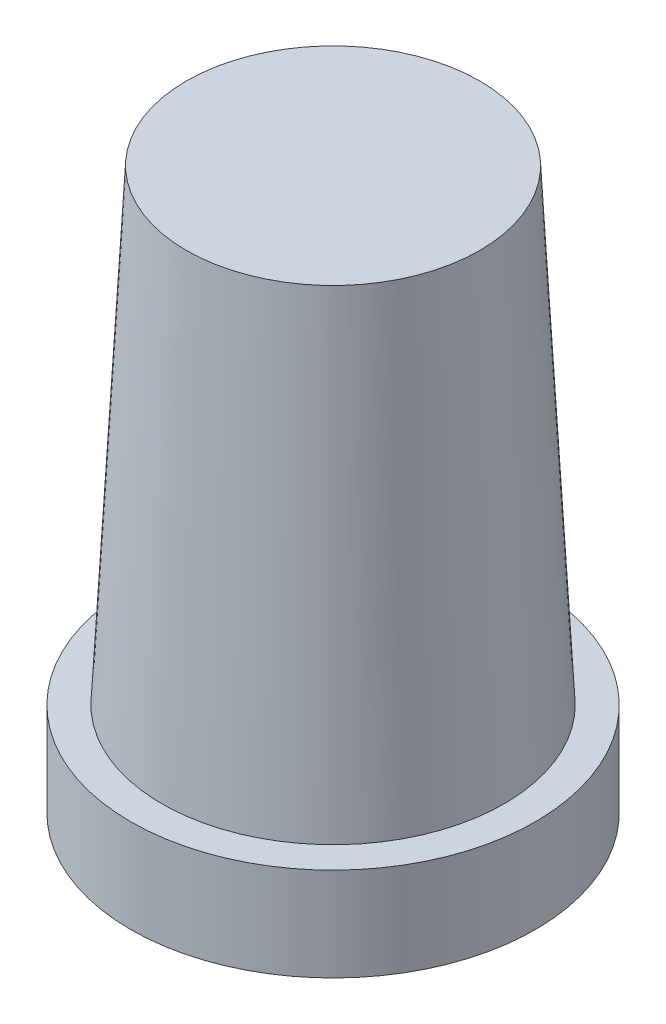
ISO-10303-21;
HEADER;
FILE_DESCRIPTION(('STEP AP214'),'2;1');
FILE_NAME('part.step','',(''),(''),'','','');
FILE_SCHEMA(('AUTOMOTIVE_DESIGN { 1 0 10303 214 1 1 1 1 }'));
ENDSEC;
DATA;
#1=APPLICATION_CONTEXT('core data for automotive mechanical design processes');
#2=APPLICATION_PROTOCOL_DEFINITION('international standard','automotive_design',2000,#1);
#3=PRODUCT_CONTEXT('',#1,'mechanical');
#4=PRODUCT('Part','Part','',(#3));
#5=PRODUCT_RELATED_PRODUCT_CATEGORY('part','',(#4));
#6=PRODUCT_DEFINITION_FORMATION('','',#4);
#7=PRODUCT_DEFINITION_CONTEXT('part definition',#1,'design');
#8=PRODUCT_DEFINITION('design','',#6,#7);
#9=PRODUCT_DEFINITION_SHAPE('','',#8);
#10=(LENGTH_UNIT() NAMED_UNIT(*) SI_UNIT(.MILLI.,.METRE.));
#11=(NAMED_UNIT(*) PLANE_ANGLE_UNIT() SI_UNIT($,.RADIAN.));
#12=(NAMED_UNIT(*) SI_UNIT($,.STERADIAN.) SOLID_ANGLE_UNIT());
#13=UNCERTAINTY_MEASURE_WITH_UNIT(LENGTH_MEASURE(1.E-05),#10,'distance_accuracy_value','');
#14=(GEOMETRIC_REPRESENTATION_CONTEXT(3) GLOBAL_UNCERTAINTY_ASSIGNED_CONTEXT((#13)) GLOBAL_UNIT_ASSIGNED_CONTEXT((#10,
#11,#12)) REPRESENTATION_CONTEXT('',''));
#15=CARTESIAN_POINT('',(0.,0.,0.));
#16=DIRECTION('',(0.,0.,1.));
#17=DIRECTION('',(1.,0.,0.));
#18=AXIS2_PLACEMENT_3D('',#15,#16,#17);
#19=CARTESIAN_POINT('',(0.,18.,0.));
#20=DIRECTION('',(0.,-1.,0.));
#21=DIRECTION('',(0.,0.,-1.));
#22=AXIS2_PLACEMENT_3D('',#19,#20,#21);
#23=CYLINDRICAL_SURFACE('',#22,6.5);
#24=CARTESIAN_POINT('',(0.,0.,0.));
#25=DIRECTION('',(0.,1.,0.));
#26=DIRECTION('',(0.,0.,1.));
#27=AXIS2_PLACEMENT_3D('',#24,#25,#26);
#28=CIRCLE('',#27,6.5);
#29=CARTESIAN_POINT('',(0.,0.,6.5));
#30=VERTEX_POINT('',#29);
#31=EDGE_CURVE('E88',#30,#30,#28,.T.);
#32=ORIENTED_EDGE('',*,*,#31,.T.);
#33=EDGE_LOOP('',(#32));
#34=FACE_BOUND('',#33,.T.);
#35=CARTESIAN_POINT('',(0.,3.,0.));
#36=DIRECTION('',(0.,1.,0.));
#37=DIRECTION('',(0.,0.,1.));
#38=AXIS2_PLACEMENT_3D('',#35,#36,#37);
#39=CIRCLE('',#38,6.5);
#40=CARTESIAN_POINT('',(0.,3.,6.5));
#41=VERTEX_POINT('',#40);
#42=EDGE_CURVE('E77',#41,#41,#39,.T.);
#43=ORIENTED_EDGE('',*,*,#42,.F.);
#44=EDGE_LOOP('',(#43));
#45=FACE_BOUND('',#44,.T.);
#46=ADVANCED_FACE('F36',(#34,#45),#23,.T.);
#47=CARTESIAN_POINT('',(0.,0.,0.));
#48=DIRECTION('',(0.,1.,0.));
#49=DIRECTION('',(0.,0.,1.));
#50=AXIS2_PLACEMENT_3D('',#47,#48,#49);
#51=PLANE('',#50);
#52=CARTESIAN_POINT('',(0.,0.,0.));
#53=DIRECTION('',(0.,1.,0.));
#54=DIRECTION('',(0.,0.,1.));
#55=AXIS2_PLACEMENT_3D('',#52,#53,#54);
#56=CIRCLE('',#55,5.57735026918963);
#57=CARTESIAN_POINT('',(0.,0.,5.57735026918963));
#58=VERTEX_POINT('',#57);
#59=EDGE_CURVE('E44',#58,#58,#56,.T.);
#60=ORIENTED_EDGE('',*,*,#59,.T.);
#61=EDGE_LOOP('',(#60));
#62=FACE_BOUND('',#61,.T.);
#63=ORIENTED_EDGE('',*,*,#31,.F.);
#64=EDGE_LOOP('',(#63));
#65=FACE_BOUND('',#64,.T.);
#66=ADVANCED_FACE('F97',(#62,#65),#51,.F.);
#67=CARTESIAN_POINT('',(0.,4.,0.));
#68=DIRECTION('',(0.,-1.,0.));
#69=DIRECTION('',(0.,0.,-1.));
#70=AXIS2_PLACEMENT_3D('',#67,#68,#69);
#71=CYLINDRICAL_SURFACE('',#70,5.);
#72=CARTESIAN_POINT('',(0.,1.00000000000001,0.));
#73=DIRECTION('',(0.,1.,0.));
#74=DIRECTION('',(0.,0.,1.));
#75=AXIS2_PLACEMENT_3D('',#72,#73,#74);
#76=CIRCLE('',#75,5.);
#77=CARTESIAN_POINT('',(0.,1.00000000000001,5.));
#78=VERTEX_POINT('',#77);
#79=EDGE_CURVE('E91',#78,#78,#76,.F.);
#80=ORIENTED_EDGE('',*,*,#79,.T.);
#81=EDGE_LOOP('',(#80));
#82=FACE_BOUND('',#81,.T.);
#83=CARTESIAN_POINT('',(0.,4.,0.));
#84=DIRECTION('',(0.,-1.,0.));
#85=DIRECTION('',(0.,0.,-1.));
#86=AXIS2_PLACEMENT_3D('',#83,#84,#85);
#87=CIRCLE('',#86,5.);
#88=CARTESIAN_POINT('',(0.,4.,-5.));
#89=VERTEX_POINT('',#88);
#90=EDGE_CURVE('E67',#89,#89,#87,.T.);
#91=ORIENTED_EDGE('',*,*,#90,.F.);
#92=EDGE_LOOP('',(#91));
#93=FACE_BOUND('',#92,.T.);
#94=ADVANCED_FACE('F107',(#82,#93),#71,.F.);
#95=CARTESIAN_POINT('',(0.,4.,0.));
#96=DIRECTION('',(0.,-1.,0.));
#97=DIRECTION('',(0.,0.,-1.));
#98=AXIS2_PLACEMENT_3D('',#95,#96,#97);
#99=PLANE('',#98);
#100=CARTESIAN_POINT('',(0.,4.,0.));
#101=DIRECTION('',(0.,-1.,0.));
#102=DIRECTION('',(0.,0.,1.));
#103=AXIS2_PLACEMENT_3D('',#100,#101,#102);
#104=CIRCLE('',#103,3.1);
#105=CARTESIAN_POINT('',(3.04828024000763,4.,-0.563903873349911));
#106=VERTEX_POINT('',#105);
#107=CARTESIAN_POINT('',(-1.73205550705109,4.,-2.57098886043756));
#108=VERTEX_POINT('',#107);
#109=EDGE_CURVE('E51',#106,#108,#104,.T.);
#110=ORIENTED_EDGE('',*,*,#109,.F.);
#111=DIRECTION('',(0.922027274643373,0.,0.387124921457807));
#112=VECTOR('',#111,1.);
#113=CARTESIAN_POINT('',(-1.73205550705109,4.,-2.57098886043756));
#114=LINE('',#113,#112);
#115=EDGE_CURVE('E71',#108,#106,#114,.T.);
#116=ORIENTED_EDGE('',*,*,#115,.F.);
#117=EDGE_LOOP('',(#110,#116));
#118=FACE_BOUND('',#117,.T.);
#119=ORIENTED_EDGE('',*,*,#90,.T.);
#120=EDGE_LOOP('',(#119));
#121=FACE_BOUND('',#120,.T.);
#122=ADVANCED_FACE('F75',(#118,#121),#99,.T.);
#123=CARTESIAN_POINT('',(0.,16.,0.));
#124=DIRECTION('',(0.,-1.,0.));
#125=DIRECTION('',(0.,0.,-1.));
#126=AXIS2_PLACEMENT_3D('',#123,#124,#125);
#127=CYLINDRICAL_SURFACE('',#126,3.1);
#128=ORIENTED_EDGE('',*,*,#109,.T.);
#129=DIRECTION('',(0.,-1.,0.));
#130=VECTOR('',#129,1.);
#131=CARTESIAN_POINT('',(-1.73205550705109,16.,-2.57098886043756));
#132=LINE('',#131,#130);
#133=CARTESIAN_POINT('',(-1.73205550705109,16.,-2.57098886043756));
#134=VERTEX_POINT('',#133);
#135=EDGE_CURVE('E68',#134,#108,#132,.T.);
#136=ORIENTED_EDGE('',*,*,#135,.F.);
#137=CARTESIAN_POINT('',(0.,16.,0.));
#138=DIRECTION('',(0.,-1.,0.));
#139=DIRECTION('',(0.,0.,1.));
#140=AXIS2_PLACEMENT_3D('',#137,#138,#139);
#141=CIRCLE('',#140,3.1);
#142=CARTESIAN_POINT('',(3.04828024000763,16.,-0.563903873349911));
#143=VERTEX_POINT('',#142);
#144=EDGE_CURVE('E65',#143,#134,#141,.T.);
#145=ORIENTED_EDGE('',*,*,#144,.F.);
#146=DIRECTION('',(0.,-1.,0.));
#147=VECTOR('',#146,1.);
#148=CARTESIAN_POINT('',(3.04828024000763,16.,-0.563903873349911));
#149=LINE('',#148,#147);
#150=EDGE_CURVE('E59',#143,#106,#149,.T.);
#151=ORIENTED_EDGE('',*,*,#150,.T.);
#152=EDGE_LOOP('',(#128,#136,#145,#151));
#153=FACE_BOUND('',#152,.T.);
#154=ADVANCED_FACE('F63',(#153),#127,.F.);
#155=CARTESIAN_POINT('',(-1.73205550705109,16.,-2.57098886043756));
#156=DIRECTION('',(0.387124921457807,0.,-0.922027274643373));
#157=DIRECTION('',(-0.922027274643373,0.,-0.387124921457807));
#158=AXIS2_PLACEMENT_3D('',#155,#156,#157);
#159=PLANE('',#158);
#160=ORIENTED_EDGE('',*,*,#115,.T.);
#161=ORIENTED_EDGE('',*,*,#150,.F.);
#162=DIRECTION('',(0.922027274643373,0.,0.387124921457807));
#163=VECTOR('',#162,1.);
#164=CARTESIAN_POINT('',(-1.73205550705109,16.,-2.57098886043756));
#165=LINE('',#164,#163);
#166=EDGE_CURVE('E82',#134,#143,#165,.T.);
#167=ORIENTED_EDGE('',*,*,#166,.F.);
#168=ORIENTED_EDGE('',*,*,#135,.T.);
#169=EDGE_LOOP('',(#160,#161,#167,#168));
#170=FACE_BOUND('',#169,.T.);
#171=ADVANCED_FACE('F72',(#170),#159,.F.);
#172=CARTESIAN_POINT('',(0.,16.,0.));
#173=DIRECTION('',(0.,1.,0.));
#174=DIRECTION('',(0.,0.,1.));
#175=AXIS2_PLACEMENT_3D('',#172,#173,#174);
#176=PLANE('',#175);
#177=ORIENTED_EDGE('',*,*,#144,.T.);
#178=ORIENTED_EDGE('',*,*,#166,.T.);
#179=EDGE_LOOP('',(#177,#178));
#180=FACE_BOUND('',#179,.T.);
#181=ADVANCED_FACE('F104',(#180),#176,.F.);
#182=CARTESIAN_POINT('',(0.,1.00000000000001,0.));
#183=DIRECTION('',(0.,-1.,0.));
#184=DIRECTION('',(0.,0.,-1.));
#185=AXIS2_PLACEMENT_3D('',#182,#183,#184);
#186=CONICAL_SURFACE('',#185,5.,0.523598775598297);
#187=ORIENTED_EDGE('',*,*,#59,.F.);
#188=EDGE_LOOP('',(#187));
#189=FACE_BOUND('',#188,.T.);
#190=ORIENTED_EDGE('',*,*,#79,.F.);
#191=EDGE_LOOP('',(#190));
#192=FACE_BOUND('',#191,.T.);
#193=ADVANCED_FACE('F100',(#189,#192),#186,.F.);
#194=CARTESIAN_POINT('',(0.,3.,0.));
#195=DIRECTION('',(0.,1.,0.));
#196=DIRECTION('',(0.,0.,1.));
#197=AXIS2_PLACEMENT_3D('',#194,#195,#196);
#198=PLANE('',#197);
#199=CARTESIAN_POINT('',(0.,3.,0.));
#200=DIRECTION('',(0.,1.,0.));
#201=DIRECTION('',(0.,0.,1.));
#202=AXIS2_PLACEMENT_3D('',#199,#200,#201);
#203=CIRCLE('',#202,5.5);
#204=CARTESIAN_POINT('',(0.,3.,-5.49999999999995));
#205=VERTEX_POINT('',#204);
#206=EDGE_CURVE('E80',#205,#205,#203,.T.);
#207=ORIENTED_EDGE('',*,*,#206,.F.);
#208=EDGE_LOOP('',(#207));
#209=FACE_BOUND('',#208,.T.);
#210=ORIENTED_EDGE('',*,*,#42,.T.);
#211=EDGE_LOOP('',(#210));
#212=FACE_BOUND('',#211,.T.);
#213=ADVANCED_FACE('F103',(#209,#212),#198,.T.);
#214=CARTESIAN_POINT('',(0.,18.,0.));
#215=DIRECTION('',(0.,1.,0.));
#216=DIRECTION('',(0.,0.,1.));
#217=AXIS2_PLACEMENT_3D('',#214,#215,#216);
#218=PLANE('',#217);
#219=CARTESIAN_POINT('',(0.,18.,0.));
#220=DIRECTION('',(0.,1.,0.));
#221=DIRECTION('',(0.,0.,1.));
#222=AXIS2_PLACEMENT_3D('',#219,#220,#221);
#223=CIRCLE('',#222,4.71388331075438);
#224=CARTESIAN_POINT('',(0.,18.,-4.71388331075438));
#225=VERTEX_POINT('',#224);
#226=EDGE_CURVE('E12',#225,#225,#223,.T.);
#227=ORIENTED_EDGE('',*,*,#226,.T.);
#228=EDGE_LOOP('',(#227));
#229=FACE_BOUND('',#228,.T.);
#230=ADVANCED_FACE('F127',(#229),#218,.T.);
#231=CARTESIAN_POINT('',(0.,18.,0.));
#232=DIRECTION('',(0.,-1.,0.));
#233=DIRECTION('',(0.,0.,-1.));
#234=AXIS2_PLACEMENT_3D('',#231,#232,#233);
#235=CONICAL_SURFACE('',#234,4.71388331075438,0.0523598775598265);
#236=CARTESIAN_POINT('',(0.,3.,-5.49999999999995));
#237=CARTESIAN_POINT('',(0.,3.15625,-5.49181128448698));
#238=CARTESIAN_POINT('',(0.,3.3125,-5.483622568974));
#239=CARTESIAN_POINT('',(0.,3.625,-5.46724513794805));
#240=CARTESIAN_POINT('',(0.,3.78125,-5.45905642243508));
#241=CARTESIAN_POINT('',(0.,4.09375,-5.44267899140913));
#242=CARTESIAN_POINT('',(0.,4.25,-5.43449027589615));
#243=CARTESIAN_POINT('',(0.,4.5625,-5.4181128448702));
#244=CARTESIAN_POINT('',(0.,4.71875,-5.40992412935723));
#245=CARTESIAN_POINT('',(0.,5.03125,-5.39354669833128));
#246=CARTESIAN_POINT('',(0.,5.1875,-5.38535798281831));
#247=CARTESIAN_POINT('',(0.,5.5,-5.36898055179236));
#248=CARTESIAN_POINT('',(0.,5.65625,-5.36079183627938));
#249=CARTESIAN_POINT('',(0.,5.96875,-5.34441440525343));
#250=CARTESIAN_POINT('',(0.,6.125,-5.33622568974046));
#251=CARTESIAN_POINT('',(0.,6.4375,-5.31984825871451));
#252=CARTESIAN_POINT('',(0.,6.59375,-5.31165954320153));
#253=CARTESIAN_POINT('',(0.,6.90625,-5.29528211217559));
#254=CARTESIAN_POINT('',(0.,7.0625,-5.28709339666261));
#255=CARTESIAN_POINT('',(0.,7.375,-5.27071596563666));
#256=CARTESIAN_POINT('',(0.,7.53125,-5.26252725012369));
#257=CARTESIAN_POINT('',(0.,7.84375,-5.24614981909774));
#258=CARTESIAN_POINT('',(0.,8.,-5.23796110358476));
#259=CARTESIAN_POINT('',(0.,8.3125,-5.22158367255881));
#260=CARTESIAN_POINT('',(0.,8.46875,-5.21339495704584));
#261=CARTESIAN_POINT('',(0.,8.78125,-5.19701752601989));
#262=CARTESIAN_POINT('',(0.,8.9375,-5.18882881050691));
#263=CARTESIAN_POINT('',(0.,9.25,-5.17245137948097));
#264=CARTESIAN_POINT('',(0.,9.40625,-5.16426266396799));
#265=CARTESIAN_POINT('',(0.,9.71875,-5.14788523294204));
#266=CARTESIAN_POINT('',(0.,9.875,-5.13969651742907));
#267=CARTESIAN_POINT('',(0.,10.1875,-5.12331908640312));
#268=CARTESIAN_POINT('',(0.,10.34375,-5.11513037089014));
#269=CARTESIAN_POINT('',(0.,10.65625,-5.09875293986419));
#270=CARTESIAN_POINT('',(0.,10.8125,-5.09056422435122));
#271=CARTESIAN_POINT('',(0.,11.125,-5.07418679332527));
#272=CARTESIAN_POINT('',(0.,11.28125,-5.06599807781229));
#273=CARTESIAN_POINT('',(0.,11.59375,-5.04962064678635));
#274=CARTESIAN_POINT('',(0.,11.75,-5.04143193127337));
#275=CARTESIAN_POINT('',(0.,12.0625,-5.02505450024742));
#276=CARTESIAN_POINT('',(0.,12.21875,-5.01686578473445));
#277=CARTESIAN_POINT('',(0.,12.53125,-5.0004883537085));
#278=CARTESIAN_POINT('',(0.,12.6875,-4.99229963819552));
#279=CARTESIAN_POINT('',(0.,13.,-4.97592220716957));
#280=CARTESIAN_POINT('',(0.,13.15625,-4.9677334916566));
#281=CARTESIAN_POINT('',(0.,13.46875,-4.95135606063065));
#282=CARTESIAN_POINT('',(0.,13.625,-4.94316734511767));
#283=CARTESIAN_POINT('',(0.,13.9375,-4.92678991409173));
#284=CARTESIAN_POINT('',(0.,14.09375,-4.91860119857875));
#285=CARTESIAN_POINT('',(0.,14.40625,-4.9022237675528));
#286=CARTESIAN_POINT('',(0.,14.5625,-4.89403505203983));
#287=CARTESIAN_POINT('',(0.,14.875,-4.87765762101388));
#288=CARTESIAN_POINT('',(0.,15.03125,-4.8694689055009));
#289=CARTESIAN_POINT('',(0.,15.34375,-4.85309147447495));
#290=CARTESIAN_POINT('',(0.,15.5,-4.84490275896198));
#291=CARTESIAN_POINT('',(0.,15.8125,-4.82852532793603));
#292=CARTESIAN_POINT('',(0.,15.96875,-4.82033661242305));
#293=CARTESIAN_POINT('',(0.,16.28125,-4.80395918139711));
#294=CARTESIAN_POINT('',(0.,16.4375,-4.79577046588413));
#295=CARTESIAN_POINT('',(0.,16.75,-4.77939303485818));
#296=CARTESIAN_POINT('',(0.,16.90625,-4.77120431934521));
#297=CARTESIAN_POINT('',(0.,17.21875,-4.75482688831926));
#298=CARTESIAN_POINT('',(0.,17.375,-4.74663817280628));
#299=CARTESIAN_POINT('',(0.,17.6875,-4.73026074178033));
#300=CARTESIAN_POINT('',(0.,17.84375,-4.72207202626736));
#301=CARTESIAN_POINT('',(0.,18.,-4.71388331075438));
#302=B_SPLINE_CURVE_WITH_KNOTS('',3,(#236,#237,#238,#239,#240,#241,#242,#243,#244,#245,#246,
#247,#248,#249,#250,#251,#252,#253,#254,#255,#256,#257,#258,#259,#260,#261,#262,#263,#264,#265,
#266,#267,#268,#269,#270,#271,#272,#273,#274,#275,#276,#277,#278,#279,#280,#281,#282,#283,#284,
#285,#286,#287,#288,#289,#290,#291,#292,#293,#294,#295,#296,#297,#298,#299,#300,#301),
.UNSPECIFIED.,.F.,.F.,(4,2,2,2,2,2,2,2,2,2,2,2,2,2,2,2,2,2,2,2,2,2,2,2,2,2,2,2,2,2,2,2,4),(0.,
0.469393287186526,0.938786574373052,1.40817986155958,1.8775731487461,2.34696643593263,
2.81635972311915,3.28575301030568,3.7551462974922,4.22453958467873,4.69393287186525,
5.16332615905178,5.63271944623831,6.10211273342483,6.57150602061135,7.04089930779788,
7.5102925949844,7.97968588217093,8.44907916935746,8.91847245654398,9.38786574373051,
9.85725903091704,10.3266523181036,10.7960456052901,11.2654388924766,11.7348321796631,
12.2042254668497,12.6736187540362,13.1430120412227,13.6124053284092,14.0817986155958,
14.5511919027823,15.0205851899688),.UNSPECIFIED.);
#303=EDGE_CURVE('BSEAM38',#205,#225,#302,.T.);
#304=ORIENTED_EDGE('',*,*,#206,.T.);
#305=ORIENTED_EDGE('',*,*,#226,.F.);
#306=ORIENTED_EDGE('',*,*,#303,.T.);
#307=ORIENTED_EDGE('',*,*,#303,.F.);
#308=EDGE_LOOP('',(#304,#306,#305,#307));
#309=FACE_BOUND('',#308,.T.);
#310=ADVANCED_FACE('F38',(#309),#235,.T.);
#311=CLOSED_SHELL('',(#46,#66,#94,#122,#154,#171,#181,#193,#213,#230,#310));
#312=MANIFOLD_SOLID_BREP('B2',#311);
#313=ADVANCED_BREP_SHAPE_REPRESENTATION('',(#18,#312),#14);
#314=SHAPE_DEFINITION_REPRESENTATION(#9,#313);
ENDSEC;
END-ISO-10303-21;
